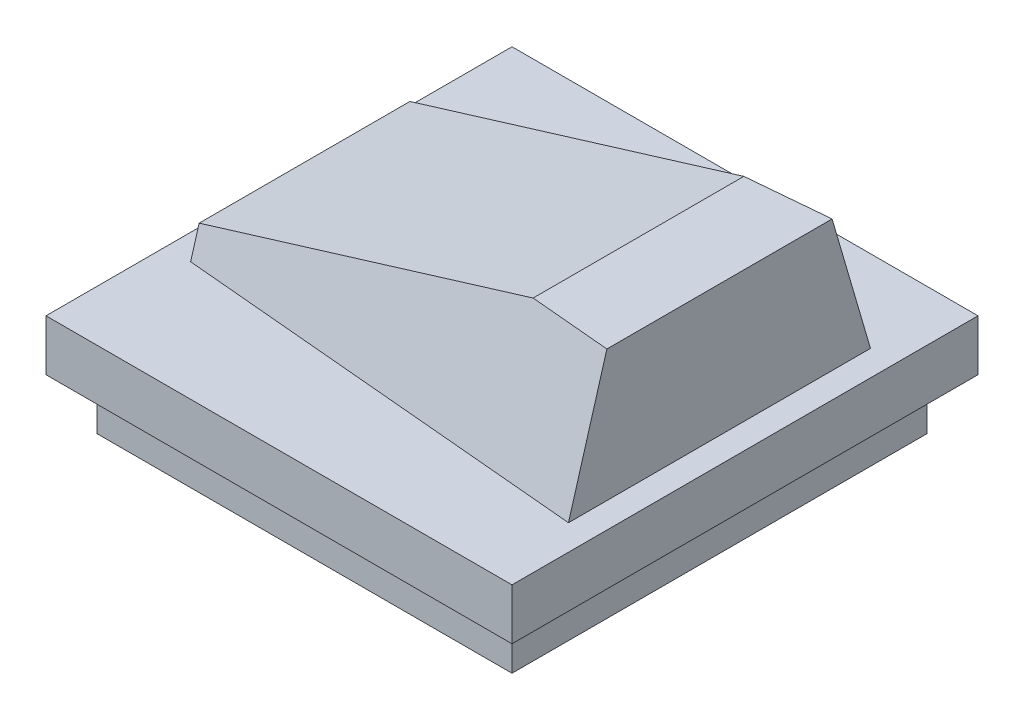
ISO-10303-21;
HEADER;
FILE_DESCRIPTION(('STEP AP214'),'2;1');
FILE_NAME('part.step','',(''),(''),'','','');
FILE_SCHEMA(('AUTOMOTIVE_DESIGN { 1 0 10303 214 1 1 1 1 }'));
ENDSEC;
DATA;
#1=APPLICATION_CONTEXT('core data for automotive mechanical design processes');
#2=APPLICATION_PROTOCOL_DEFINITION('international standard','automotive_design',2000,#1);
#3=PRODUCT_CONTEXT('',#1,'mechanical');
#4=PRODUCT('Part','Part','',(#3));
#5=PRODUCT_RELATED_PRODUCT_CATEGORY('part','',(#4));
#6=PRODUCT_DEFINITION_FORMATION('','',#4);
#7=PRODUCT_DEFINITION_CONTEXT('part definition',#1,'design');
#8=PRODUCT_DEFINITION('design','',#6,#7);
#9=PRODUCT_DEFINITION_SHAPE('','',#8);
#10=(LENGTH_UNIT() NAMED_UNIT(*) SI_UNIT(.MILLI.,.METRE.));
#11=(NAMED_UNIT(*) PLANE_ANGLE_UNIT() SI_UNIT($,.RADIAN.));
#12=(NAMED_UNIT(*) SI_UNIT($,.STERADIAN.) SOLID_ANGLE_UNIT());
#13=UNCERTAINTY_MEASURE_WITH_UNIT(LENGTH_MEASURE(1.E-05),#10,'distance_accuracy_value','');
#14=(GEOMETRIC_REPRESENTATION_CONTEXT(3) GLOBAL_UNCERTAINTY_ASSIGNED_CONTEXT((#13)) GLOBAL_UNIT_ASSIGNED_CONTEXT((#10,
#11,#12)) REPRESENTATION_CONTEXT('',''));
#15=CARTESIAN_POINT('',(0.,0.,0.));
#16=DIRECTION('',(0.,0.,1.));
#17=DIRECTION('',(1.,0.,0.));
#18=AXIS2_PLACEMENT_3D('',#15,#16,#17);
#19=CARTESIAN_POINT('',(0.,457.2,0.));
#20=DIRECTION('',(1.,0.,0.));
#21=DIRECTION('',(0.,0.,-1.));
#22=AXIS2_PLACEMENT_3D('',#19,#20,#21);
#23=PLANE('',#22);
#24=DIRECTION('',(0.,0.,-1.));
#25=VECTOR('',#24,1.);
#26=CARTESIAN_POINT('',(0.,257.2,0.));
#27=LINE('',#26,#25);
#28=CARTESIAN_POINT('',(0.,257.2,-200.000000000005));
#29=VERTEX_POINT('',#28);
#30=CARTESIAN_POINT('',(0.,257.2,-612.799999999995));
#31=VERTEX_POINT('',#30);
#32=EDGE_CURVE('E149',#29,#31,#27,.T.);
#33=ORIENTED_EDGE('',*,*,#32,.T.);
#34=DIRECTION('',(0.,0.959817898275245,0.280623595142125));
#35=VECTOR('',#34,1.);
#36=CARTESIAN_POINT('',(0.,-357.241293677424,-792.445248484506));
#37=LINE('',#36,#35);
#38=CARTESIAN_POINT('',(-1.71976295166064E-13,200.,-629.523661510136));
#39=VERTEX_POINT('',#38);
#40=EDGE_CURVE('E174',#31,#39,#37,.F.);
#41=ORIENTED_EDGE('',*,*,#40,.T.);
#42=DIRECTION('',(0.,0.,1.));
#43=VECTOR('',#42,1.);
#44=CARTESIAN_POINT('',(0.,200.,0.));
#45=LINE('',#44,#43);
#46=CARTESIAN_POINT('',(0.,200.,-183.276338489864));
#47=VERTEX_POINT('',#46);
#48=EDGE_CURVE('E179',#39,#47,#45,.T.);
#49=ORIENTED_EDGE('',*,*,#48,.T.);
#50=DIRECTION('',(0.,-0.959817898275245,0.280623595142125));
#51=VECTOR('',#50,1.);
#52=CARTESIAN_POINT('',(0.,-357.241293677424,-20.3547515154944));
#53=LINE('',#52,#51);
#54=EDGE_CURVE('E172',#47,#29,#53,.F.);
#55=ORIENTED_EDGE('',*,*,#54,.T.);
#56=EDGE_LOOP('',(#33,#41,#49,#55));
#57=FACE_BOUND('',#56,.T.);
#58=ADVANCED_FACE('F33',(#57),#23,.F.);
#59=CARTESIAN_POINT('',(812.8,457.2,0.));
#60=DIRECTION('',(-1.,0.,0.));
#61=DIRECTION('',(0.,0.,1.));
#62=AXIS2_PLACEMENT_3D('',#59,#60,#61);
#63=PLANE('',#62);
#64=DIRECTION('',(0.,0.,-1.));
#65=VECTOR('',#64,1.);
#66=CARTESIAN_POINT('',(812.8,200.,0.));
#67=LINE('',#66,#65);
#68=CARTESIAN_POINT('',(812.8,200.,-110.622584463866));
#69=VERTEX_POINT('',#68);
#70=CARTESIAN_POINT('',(812.8,200.,-702.177415536134));
#71=VERTEX_POINT('',#70);
#72=EDGE_CURVE('E178',#69,#71,#67,.T.);
#73=ORIENTED_EDGE('',*,*,#72,.T.);
#74=DIRECTION('',(0.,-0.959817898275245,-0.280623595142125));
#75=VECTOR('',#74,1.);
#76=CARTESIAN_POINT('',(812.8,-337.672183083384,-859.377548286217));
#77=LINE('',#76,#75);
#78=CARTESIAN_POINT('',(812.8,457.2,-626.979413081447));
#79=VERTEX_POINT('',#78);
#80=EDGE_CURVE('E160',#71,#79,#77,.F.);
#81=ORIENTED_EDGE('',*,*,#80,.T.);
#82=DIRECTION('',(0.,0.,-1.));
#83=VECTOR('',#82,1.);
#84=CARTESIAN_POINT('',(812.8,457.2,0.));
#85=LINE('',#84,#83);
#86=CARTESIAN_POINT('',(812.8,457.2,-185.820586918553));
#87=VERTEX_POINT('',#86);
#88=EDGE_CURVE('E195',#87,#79,#85,.T.);
#89=ORIENTED_EDGE('',*,*,#88,.F.);
#90=DIRECTION('',(0.,0.959817898275245,-0.280623595142125));
#91=VECTOR('',#90,1.);
#92=CARTESIAN_POINT('',(812.8,-337.672183083384,46.5775482862168));
#93=LINE('',#92,#91);
#94=EDGE_CURVE('E157',#87,#69,#93,.F.);
#95=ORIENTED_EDGE('',*,*,#94,.T.);
#96=EDGE_LOOP('',(#73,#81,#89,#95));
#97=FACE_BOUND('',#96,.T.);
#98=ADVANCED_FACE('F183',(#97),#63,.F.);
#99=CARTESIAN_POINT('',(0.,457.2,0.));
#100=DIRECTION('',(0.,-1.,0.));
#101=DIRECTION('',(0.,0.,-1.));
#102=AXIS2_PLACEMENT_3D('',#99,#100,#101);
#103=PLANE('',#102);
#104=ORIENTED_EDGE('',*,*,#88,.T.);
#105=DIRECTION('',(0.996028764024638,0.,-0.0890320236519009));
#106=VECTOR('',#105,1.);
#107=CARTESIAN_POINT('',(268.142023207445,457.2,-578.294070224429));
#108=LINE('',#107,#106);
#109=CARTESIAN_POINT('',(654.170523696826,457.2,-612.799999999995));
#110=VERTEX_POINT('',#109);
#111=EDGE_CURVE('E164',#79,#110,#108,.F.);
#112=ORIENTED_EDGE('',*,*,#111,.T.);
#113=DIRECTION('',(0.,0.,1.));
#114=VECTOR('',#113,1.);
#115=CARTESIAN_POINT('',(654.170523696826,457.2,0.));
#116=LINE('',#115,#114);
#117=CARTESIAN_POINT('',(654.170523696826,457.2,-200.000000000005));
#118=VERTEX_POINT('',#117);
#119=EDGE_CURVE('E146',#110,#118,#116,.T.);
#120=ORIENTED_EDGE('',*,*,#119,.T.);
#121=DIRECTION('',(-0.996028764024638,0.,-0.0890320236519009));
#122=VECTOR('',#121,1.);
#123=CARTESIAN_POINT('',(268.142023207445,457.2,-234.505929775571));
#124=LINE('',#123,#122);
#125=EDGE_CURVE('E162',#118,#87,#124,.F.);
#126=ORIENTED_EDGE('',*,*,#125,.T.);
#127=EDGE_LOOP('',(#104,#112,#120,#126));
#128=FACE_BOUND('',#127,.T.);
#129=ADVANCED_FACE('F194',(#128),#103,.F.);
#130=CARTESIAN_POINT('',(0.,200.,0.));
#131=DIRECTION('',(0.,-1.,0.));
#132=DIRECTION('',(0.,0.,-1.));
#133=AXIS2_PLACEMENT_3D('',#130,#131,#132);
#134=PLANE('',#133);
#135=DIRECTION('',(0.,0.,1.));
#136=VECTOR('',#135,1.);
#137=CARTESIAN_POINT('',(-50.,200.,50.));
#138=LINE('',#137,#136);
#139=CARTESIAN_POINT('',(-50.0000000000002,200.,-862.8));
#140=VERTEX_POINT('',#139);
#141=CARTESIAN_POINT('',(-50.,200.,50.));
#142=VERTEX_POINT('',#141);
#143=EDGE_CURVE('E361',#140,#142,#138,.T.);
#144=ORIENTED_EDGE('',*,*,#143,.T.);
#145=DIRECTION('',(1.,0.,0.));
#146=VECTOR('',#145,1.);
#147=CARTESIAN_POINT('',(-50.,200.,50.));
#148=LINE('',#147,#146);
#149=CARTESIAN_POINT('',(862.8,200.,50.));
#150=VERTEX_POINT('',#149);
#151=EDGE_CURVE('E363',#142,#150,#148,.T.);
#152=ORIENTED_EDGE('',*,*,#151,.T.);
#153=DIRECTION('',(0.,0.,-1.));
#154=VECTOR('',#153,1.);
#155=CARTESIAN_POINT('',(862.8,200.,50.));
#156=LINE('',#155,#154);
#157=CARTESIAN_POINT('',(862.8,200.,-862.8));
#158=VERTEX_POINT('',#157);
#159=EDGE_CURVE('E391',#150,#158,#156,.T.);
#160=ORIENTED_EDGE('',*,*,#159,.T.);
#161=DIRECTION('',(-1.,0.,0.));
#162=VECTOR('',#161,1.);
#163=CARTESIAN_POINT('',(-50.0000000000002,200.,-862.8));
#164=LINE('',#163,#162);
#165=EDGE_CURVE('E366',#158,#140,#164,.T.);
#166=ORIENTED_EDGE('',*,*,#165,.T.);
#167=EDGE_LOOP('',(#144,#152,#160,#166));
#168=FACE_BOUND('',#167,.T.);
#169=ORIENTED_EDGE('',*,*,#48,.F.);
#170=DIRECTION('',(-0.996028764024638,0.,0.0890320236519009));
#171=VECTOR('',#170,1.);
#172=CARTESIAN_POINT('',(-55.825186618226,200.,-624.533615524633));
#173=LINE('',#172,#171);
#174=EDGE_CURVE('E42',#39,#71,#173,.F.);
#175=ORIENTED_EDGE('',*,*,#174,.T.);
#176=ORIENTED_EDGE('',*,*,#72,.F.);
#177=DIRECTION('',(0.996028764024638,0.,0.0890320236519009));
#178=VECTOR('',#177,1.);
#179=CARTESIAN_POINT('',(16.2526628059668,200.,-181.823561711109));
#180=LINE('',#179,#178);
#181=EDGE_CURVE('E11',#69,#47,#180,.F.);
#182=ORIENTED_EDGE('',*,*,#181,.T.);
#183=EDGE_LOOP('',(#169,#175,#176,#182));
#184=FACE_BOUND('',#183,.T.);
#185=ADVANCED_FACE('F177',(#168,#184),#134,.F.);
#186=CARTESIAN_POINT('',(0.,100.,0.));
#187=DIRECTION('',(0.,-1.,0.));
#188=DIRECTION('',(0.,0.,-1.));
#189=AXIS2_PLACEMENT_3D('',#186,#187,#188);
#190=PLANE('',#189);
#191=DIRECTION('',(0.,0.,1.));
#192=VECTOR('',#191,1.);
#193=CARTESIAN_POINT('',(-50.,100.,50.));
#194=LINE('',#193,#192);
#195=CARTESIAN_POINT('',(-50.0000000000002,100.,-862.8));
#196=VERTEX_POINT('',#195);
#197=CARTESIAN_POINT('',(-50.,100.,50.));
#198=VERTEX_POINT('',#197);
#199=EDGE_CURVE('E187',#196,#198,#194,.T.);
#200=ORIENTED_EDGE('',*,*,#199,.F.);
#201=DIRECTION('',(-1.,0.,0.));
#202=VECTOR('',#201,1.);
#203=CARTESIAN_POINT('',(-50.0000000000002,100.,-862.8));
#204=LINE('',#203,#202);
#205=CARTESIAN_POINT('',(862.8,100.,-862.8));
#206=VERTEX_POINT('',#205);
#207=EDGE_CURVE('E369',#206,#196,#204,.T.);
#208=ORIENTED_EDGE('',*,*,#207,.F.);
#209=DIRECTION('',(0.,0.,-1.));
#210=VECTOR('',#209,1.);
#211=CARTESIAN_POINT('',(862.8,100.,50.));
#212=LINE('',#211,#210);
#213=CARTESIAN_POINT('',(862.8,100.,50.));
#214=VERTEX_POINT('',#213);
#215=EDGE_CURVE('E385',#214,#206,#212,.T.);
#216=ORIENTED_EDGE('',*,*,#215,.F.);
#217=DIRECTION('',(1.,0.,0.));
#218=VECTOR('',#217,1.);
#219=CARTESIAN_POINT('',(-50.,100.,50.));
#220=LINE('',#219,#218);
#221=EDGE_CURVE('E387',#198,#214,#220,.T.);
#222=ORIENTED_EDGE('',*,*,#221,.F.);
#223=EDGE_LOOP('',(#200,#208,#216,#222));
#224=FACE_BOUND('',#223,.T.);
#225=DIRECTION('',(-1.,0.,0.));
#226=VECTOR('',#225,1.);
#227=CARTESIAN_POINT('',(-2.22044604925031E-13,100.,-812.8));
#228=LINE('',#227,#226);
#229=CARTESIAN_POINT('',(812.8,100.,-812.8));
#230=VERTEX_POINT('',#229);
#231=CARTESIAN_POINT('',(-2.22044604925031E-13,100.,-812.8));
#232=VERTEX_POINT('',#231);
#233=EDGE_CURVE('E128',#230,#232,#228,.T.);
#234=ORIENTED_EDGE('',*,*,#233,.T.);
#235=DIRECTION('',(0.,0.,1.));
#236=VECTOR('',#235,1.);
#237=CARTESIAN_POINT('',(0.,100.,0.));
#238=LINE('',#237,#236);
#239=CARTESIAN_POINT('',(0.,100.,0.));
#240=VERTEX_POINT('',#239);
#241=EDGE_CURVE('E122',#232,#240,#238,.T.);
#242=ORIENTED_EDGE('',*,*,#241,.T.);
#243=DIRECTION('',(1.,0.,0.));
#244=VECTOR('',#243,1.);
#245=CARTESIAN_POINT('',(0.,100.,0.));
#246=LINE('',#245,#244);
#247=CARTESIAN_POINT('',(812.8,100.,0.));
#248=VERTEX_POINT('',#247);
#249=EDGE_CURVE('E125',#240,#248,#246,.T.);
#250=ORIENTED_EDGE('',*,*,#249,.T.);
#251=DIRECTION('',(0.,0.,-1.));
#252=VECTOR('',#251,1.);
#253=CARTESIAN_POINT('',(812.8,100.,0.));
#254=LINE('',#253,#252);
#255=EDGE_CURVE('E140',#248,#230,#254,.T.);
#256=ORIENTED_EDGE('',*,*,#255,.T.);
#257=EDGE_LOOP('',(#234,#242,#250,#256));
#258=FACE_BOUND('',#257,.T.);
#259=ADVANCED_FACE('F124',(#224,#258),#190,.T.);
#260=CARTESIAN_POINT('',(-50.,200.,50.));
#261=DIRECTION('',(1.,0.,0.));
#262=DIRECTION('',(0.,0.,-1.));
#263=AXIS2_PLACEMENT_3D('',#260,#261,#262);
#264=PLANE('',#263);
#265=ORIENTED_EDGE('',*,*,#199,.T.);
#266=DIRECTION('',(0.,-1.,0.));
#267=VECTOR('',#266,1.);
#268=CARTESIAN_POINT('',(-50.,200.,50.));
#269=LINE('',#268,#267);
#270=EDGE_CURVE('E211',#142,#198,#269,.T.);
#271=ORIENTED_EDGE('',*,*,#270,.F.);
#272=ORIENTED_EDGE('',*,*,#143,.F.);
#273=DIRECTION('',(0.,-1.,0.));
#274=VECTOR('',#273,1.);
#275=CARTESIAN_POINT('',(-50.0000000000002,200.,-862.8));
#276=LINE('',#275,#274);
#277=EDGE_CURVE('E380',#140,#196,#276,.T.);
#278=ORIENTED_EDGE('',*,*,#277,.T.);
#279=EDGE_LOOP('',(#265,#271,#272,#278));
#280=FACE_BOUND('',#279,.T.);
#281=ADVANCED_FACE('F288',(#280),#264,.F.);
#282=CARTESIAN_POINT('',(-50.,200.,50.));
#283=DIRECTION('',(0.,0.,-1.));
#284=DIRECTION('',(-1.,0.,0.));
#285=AXIS2_PLACEMENT_3D('',#282,#283,#284);
#286=PLANE('',#285);
#287=ORIENTED_EDGE('',*,*,#221,.T.);
#288=DIRECTION('',(0.,-1.,0.));
#289=VECTOR('',#288,1.);
#290=CARTESIAN_POINT('',(862.8,200.,50.));
#291=LINE('',#290,#289);
#292=EDGE_CURVE('E374',#150,#214,#291,.T.);
#293=ORIENTED_EDGE('',*,*,#292,.F.);
#294=ORIENTED_EDGE('',*,*,#151,.F.);
#295=ORIENTED_EDGE('',*,*,#270,.T.);
#296=EDGE_LOOP('',(#287,#293,#294,#295));
#297=FACE_BOUND('',#296,.T.);
#298=ADVANCED_FACE('F278',(#297),#286,.F.);
#299=CARTESIAN_POINT('',(862.8,200.,50.));
#300=DIRECTION('',(-1.,0.,0.));
#301=DIRECTION('',(0.,0.,1.));
#302=AXIS2_PLACEMENT_3D('',#299,#300,#301);
#303=PLANE('',#302);
#304=ORIENTED_EDGE('',*,*,#215,.T.);
#305=DIRECTION('',(0.,-1.,0.));
#306=VECTOR('',#305,1.);
#307=CARTESIAN_POINT('',(862.8,200.,-862.8));
#308=LINE('',#307,#306);
#309=EDGE_CURVE('E376',#158,#206,#308,.T.);
#310=ORIENTED_EDGE('',*,*,#309,.F.);
#311=ORIENTED_EDGE('',*,*,#159,.F.);
#312=ORIENTED_EDGE('',*,*,#292,.T.);
#313=EDGE_LOOP('',(#304,#310,#311,#312));
#314=FACE_BOUND('',#313,.T.);
#315=ADVANCED_FACE('F234',(#314),#303,.F.);
#316=CARTESIAN_POINT('',(-50.0000000000002,200.,-862.8));
#317=DIRECTION('',(0.,0.,1.));
#318=DIRECTION('',(1.,0.,0.));
#319=AXIS2_PLACEMENT_3D('',#316,#317,#318);
#320=PLANE('',#319);
#321=ORIENTED_EDGE('',*,*,#207,.T.);
#322=ORIENTED_EDGE('',*,*,#277,.F.);
#323=ORIENTED_EDGE('',*,*,#165,.F.);
#324=ORIENTED_EDGE('',*,*,#309,.T.);
#325=EDGE_LOOP('',(#321,#322,#323,#324));
#326=FACE_BOUND('',#325,.T.);
#327=ADVANCED_FACE('F227',(#326),#320,.F.);
#328=CARTESIAN_POINT('',(0.,0.,0.));
#329=DIRECTION('',(0.,-1.,0.));
#330=DIRECTION('',(0.,0.,-1.));
#331=AXIS2_PLACEMENT_3D('',#328,#329,#330);
#332=PLANE('',#331);
#333=DIRECTION('',(0.,0.,1.));
#334=VECTOR('',#333,1.);
#335=CARTESIAN_POINT('',(0.,0.,0.));
#336=LINE('',#335,#334);
#337=CARTESIAN_POINT('',(0.,0.,-812.8));
#338=VERTEX_POINT('',#337);
#339=CARTESIAN_POINT('',(0.,0.,0.));
#340=VERTEX_POINT('',#339);
#341=EDGE_CURVE('E145',#338,#340,#336,.T.);
#342=ORIENTED_EDGE('',*,*,#341,.F.);
#343=DIRECTION('',(-1.,0.,0.));
#344=VECTOR('',#343,1.);
#345=CARTESIAN_POINT('',(0.,0.,-812.8));
#346=LINE('',#345,#344);
#347=CARTESIAN_POINT('',(812.8,0.,-812.8));
#348=VERTEX_POINT('',#347);
#349=EDGE_CURVE('E203',#348,#338,#346,.T.);
#350=ORIENTED_EDGE('',*,*,#349,.F.);
#351=DIRECTION('',(0.,0.,-1.));
#352=VECTOR('',#351,1.);
#353=CARTESIAN_POINT('',(812.8,0.,0.));
#354=LINE('',#353,#352);
#355=CARTESIAN_POINT('',(812.8,0.,0.));
#356=VERTEX_POINT('',#355);
#357=EDGE_CURVE('E207',#356,#348,#354,.T.);
#358=ORIENTED_EDGE('',*,*,#357,.F.);
#359=DIRECTION('',(1.,0.,0.));
#360=VECTOR('',#359,1.);
#361=CARTESIAN_POINT('',(0.,0.,0.));
#362=LINE('',#361,#360);
#363=EDGE_CURVE('E214',#340,#356,#362,.T.);
#364=ORIENTED_EDGE('',*,*,#363,.F.);
#365=EDGE_LOOP('',(#342,#350,#358,#364));
#366=FACE_BOUND('',#365,.T.);
#367=ADVANCED_FACE('F225',(#366),#332,.T.);
#368=CARTESIAN_POINT('',(0.,457.2,-812.8));
#369=DIRECTION('',(0.,0.,1.));
#370=DIRECTION('',(1.,0.,0.));
#371=AXIS2_PLACEMENT_3D('',#368,#369,#370);
#372=PLANE('',#371);
#373=DIRECTION('',(0.,-1.,0.));
#374=VECTOR('',#373,1.);
#375=CARTESIAN_POINT('',(0.,457.2,-812.8));
#376=LINE('',#375,#374);
#377=EDGE_CURVE('E202',#232,#338,#376,.T.);
#378=ORIENTED_EDGE('',*,*,#377,.F.);
#379=ORIENTED_EDGE('',*,*,#233,.F.);
#380=DIRECTION('',(0.,-1.,0.));
#381=VECTOR('',#380,1.);
#382=CARTESIAN_POINT('',(812.8,457.2,-812.8));
#383=LINE('',#382,#381);
#384=EDGE_CURVE('E151',#230,#348,#383,.T.);
#385=ORIENTED_EDGE('',*,*,#384,.T.);
#386=ORIENTED_EDGE('',*,*,#349,.T.);
#387=EDGE_LOOP('',(#378,#379,#385,#386));
#388=FACE_BOUND('',#387,.T.);
#389=ADVANCED_FACE('F219',(#388),#372,.F.);
#390=ORIENTED_EDGE('',*,*,#384,.F.);
#391=ORIENTED_EDGE('',*,*,#255,.F.);
#392=DIRECTION('',(0.,-1.,0.));
#393=VECTOR('',#392,1.);
#394=CARTESIAN_POINT('',(812.8,457.2,0.));
#395=LINE('',#394,#393);
#396=EDGE_CURVE('E139',#248,#356,#395,.T.);
#397=ORIENTED_EDGE('',*,*,#396,.T.);
#398=ORIENTED_EDGE('',*,*,#357,.T.);
#399=EDGE_LOOP('',(#390,#391,#397,#398));
#400=FACE_BOUND('',#399,.T.);
#401=ADVANCED_FACE('F223',(#400),#63,.F.);
#402=CARTESIAN_POINT('',(0.,457.2,0.));
#403=DIRECTION('',(0.,0.,-1.));
#404=DIRECTION('',(-1.,0.,0.));
#405=AXIS2_PLACEMENT_3D('',#402,#403,#404);
#406=PLANE('',#405);
#407=ORIENTED_EDGE('',*,*,#396,.F.);
#408=ORIENTED_EDGE('',*,*,#249,.F.);
#409=DIRECTION('',(0.,-1.,0.));
#410=VECTOR('',#409,1.);
#411=CARTESIAN_POINT('',(0.,457.2,0.));
#412=LINE('',#411,#410);
#413=EDGE_CURVE('E137',#240,#340,#412,.T.);
#414=ORIENTED_EDGE('',*,*,#413,.T.);
#415=ORIENTED_EDGE('',*,*,#363,.T.);
#416=EDGE_LOOP('',(#407,#408,#414,#415));
#417=FACE_BOUND('',#416,.T.);
#418=ADVANCED_FACE('F135',(#417),#406,.F.);
#419=ORIENTED_EDGE('',*,*,#413,.F.);
#420=ORIENTED_EDGE('',*,*,#241,.F.);
#421=ORIENTED_EDGE('',*,*,#377,.T.);
#422=ORIENTED_EDGE('',*,*,#341,.T.);
#423=EDGE_LOOP('',(#419,#420,#421,#422));
#424=FACE_BOUND('',#423,.T.);
#425=ADVANCED_FACE('F143',(#424),#23,.F.);
#426=CARTESIAN_POINT('',(654.170523696826,457.2,0.));
#427=DIRECTION('',(0.292371704722738,-0.956304755963035,0.));
#428=DIRECTION('',(0.,0.,1.));
#429=AXIS2_PLACEMENT_3D('',#426,#427,#428);
#430=PLANE('',#429);
#431=ORIENTED_EDGE('',*,*,#119,.F.);
#432=DIRECTION('',(0.956304755963035,0.292371704722738,0.));
#433=VECTOR('',#432,1.);
#434=CARTESIAN_POINT('',(0.,257.2,-612.799999999995));
#435=LINE('',#434,#433);
#436=EDGE_CURVE('E169',#110,#31,#435,.F.);
#437=ORIENTED_EDGE('',*,*,#436,.T.);
#438=ORIENTED_EDGE('',*,*,#32,.F.);
#439=DIRECTION('',(-0.956304755963035,-0.292371704722738,0.));
#440=VECTOR('',#439,1.);
#441=CARTESIAN_POINT('',(654.170523696826,457.2,-200.000000000005));
#442=LINE('',#441,#440);
#443=EDGE_CURVE('E166',#29,#118,#442,.F.);
#444=ORIENTED_EDGE('',*,*,#443,.T.);
#445=EDGE_LOOP('',(#431,#437,#438,#444));
#446=FACE_BOUND('',#445,.T.);
#447=ADVANCED_FACE('F197',(#446),#430,.F.);
#448=CARTESIAN_POINT('',(247.180241539689,-351.290140277631,-812.8));
#449=DIRECTION('',(0.0854812137224787,-0.279596451735371,0.956304755963036));
#450=DIRECTION('',(0.956304755963035,0.292371704722738,0.));
#451=AXIS2_PLACEMENT_3D('',#448,#449,#450);
#452=PLANE('',#451);
#453=ORIENTED_EDGE('',*,*,#40,.F.);
#454=ORIENTED_EDGE('',*,*,#436,.F.);
#455=ORIENTED_EDGE('',*,*,#111,.F.);
#456=ORIENTED_EDGE('',*,*,#80,.F.);
#457=ORIENTED_EDGE('',*,*,#174,.F.);
#458=EDGE_LOOP('',(#453,#454,#455,#456,#457));
#459=FACE_BOUND('',#458,.T.);
#460=ADVANCED_FACE('F190',(#459),#452,.F.);
#461=CARTESIAN_POINT('',(247.180241539689,-351.290140277631,0.));
#462=DIRECTION('',(0.0854812137224787,-0.279596451735371,-0.956304755963036));
#463=DIRECTION('',(-0.956304755963035,-0.292371704722738,0.));
#464=AXIS2_PLACEMENT_3D('',#461,#462,#463);
#465=PLANE('',#464);
#466=ORIENTED_EDGE('',*,*,#125,.F.);
#467=ORIENTED_EDGE('',*,*,#443,.F.);
#468=ORIENTED_EDGE('',*,*,#54,.F.);
#469=ORIENTED_EDGE('',*,*,#181,.F.);
#470=ORIENTED_EDGE('',*,*,#94,.F.);
#471=EDGE_LOOP('',(#466,#467,#468,#469,#470));
#472=FACE_BOUND('',#471,.T.);
#473=ADVANCED_FACE('F35',(#472),#465,.F.);
#474=CLOSED_SHELL('',(#58,#98,#129,#185,#259,#281,#298,#315,#327,#367,#389,#401,#418,#425,#447,
#460,#473));
#475=MANIFOLD_SOLID_BREP('B2',#474);
#476=ADVANCED_BREP_SHAPE_REPRESENTATION('',(#18,#475),#14);
#477=SHAPE_DEFINITION_REPRESENTATION(#9,#476);
ENDSEC;
END-ISO-10303-21;
